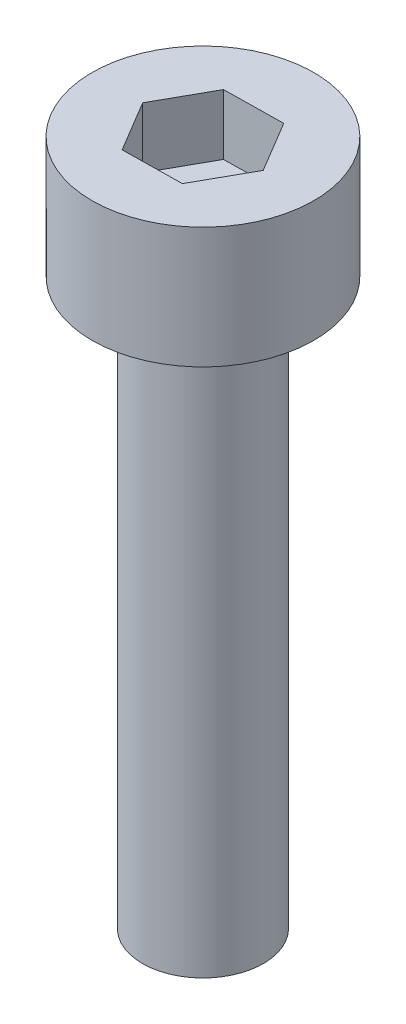
ISO-10303-21;
HEADER;
FILE_DESCRIPTION(('STEP AP214'),'2;1');
FILE_NAME('part.step','',(''),(''),'','','');
FILE_SCHEMA(('AUTOMOTIVE_DESIGN { 1 0 10303 214 1 1 1 1 }'));
ENDSEC;
DATA;
#1=APPLICATION_CONTEXT('core data for automotive mechanical design processes');
#2=APPLICATION_PROTOCOL_DEFINITION('international standard','automotive_design',2000,#1);
#3=PRODUCT_CONTEXT('',#1,'mechanical');
#4=PRODUCT('Part','Part','',(#3));
#5=PRODUCT_RELATED_PRODUCT_CATEGORY('part','',(#4));
#6=PRODUCT_DEFINITION_FORMATION('','',#4);
#7=PRODUCT_DEFINITION_CONTEXT('part definition',#1,'design');
#8=PRODUCT_DEFINITION('design','',#6,#7);
#9=PRODUCT_DEFINITION_SHAPE('','',#8);
#10=(LENGTH_UNIT() NAMED_UNIT(*) SI_UNIT(.MILLI.,.METRE.));
#11=(NAMED_UNIT(*) PLANE_ANGLE_UNIT() SI_UNIT($,.RADIAN.));
#12=(NAMED_UNIT(*) SI_UNIT($,.STERADIAN.) SOLID_ANGLE_UNIT());
#13=UNCERTAINTY_MEASURE_WITH_UNIT(LENGTH_MEASURE(1.E-05),#10,'distance_accuracy_value','');
#14=(GEOMETRIC_REPRESENTATION_CONTEXT(3) GLOBAL_UNCERTAINTY_ASSIGNED_CONTEXT((#13)) GLOBAL_UNIT_ASSIGNED_CONTEXT((#10,
#11,#12)) REPRESENTATION_CONTEXT('',''));
#15=CARTESIAN_POINT('',(0.,0.,0.));
#16=DIRECTION('',(0.,0.,1.));
#17=DIRECTION('',(1.,0.,0.));
#18=AXIS2_PLACEMENT_3D('',#15,#16,#17);
#19=CARTESIAN_POINT('',(0.,14.,0.));
#20=DIRECTION('',(0.,-1.,0.));
#21=DIRECTION('',(0.,0.,-1.));
#22=AXIS2_PLACEMENT_3D('',#19,#20,#21);
#23=CYLINDRICAL_SURFACE('',#22,1.5);
#24=CARTESIAN_POINT('',(0.,14.,0.));
#25=DIRECTION('',(0.,1.,0.));
#26=DIRECTION('',(0.,0.,1.));
#27=AXIS2_PLACEMENT_3D('',#24,#25,#26);
#28=CIRCLE('',#27,1.5);
#29=CARTESIAN_POINT('',(0.,14.,1.5));
#30=VERTEX_POINT('',#29);
#31=EDGE_CURVE('E11',#30,#30,#28,.T.);
#32=ORIENTED_EDGE('',*,*,#31,.F.);
#33=EDGE_LOOP('',(#32));
#34=FACE_BOUND('',#33,.T.);
#35=CARTESIAN_POINT('',(0.,0.,0.));
#36=DIRECTION('',(0.,1.,0.));
#37=DIRECTION('',(0.,0.,1.));
#38=AXIS2_PLACEMENT_3D('',#35,#36,#37);
#39=CIRCLE('',#38,1.5);
#40=CARTESIAN_POINT('',(0.,0.,1.5));
#41=VERTEX_POINT('',#40);
#42=EDGE_CURVE('E24',#41,#41,#39,.T.);
#43=ORIENTED_EDGE('',*,*,#42,.T.);
#44=EDGE_LOOP('',(#43));
#45=FACE_BOUND('',#44,.T.);
#46=ADVANCED_FACE('F17',(#34,#45),#23,.T.);
#47=CARTESIAN_POINT('',(0.,0.,0.));
#48=DIRECTION('',(0.,1.,0.));
#49=DIRECTION('',(0.,0.,1.));
#50=AXIS2_PLACEMENT_3D('',#47,#48,#49);
#51=PLANE('',#50);
#52=ORIENTED_EDGE('',*,*,#42,.F.);
#53=EDGE_LOOP('',(#52));
#54=FACE_BOUND('',#53,.T.);
#55=ADVANCED_FACE('F132',(#54),#51,.F.);
#56=CARTESIAN_POINT('',(0.,17.,0.));
#57=DIRECTION('',(0.,-1.,0.));
#58=DIRECTION('',(0.,0.,-1.));
#59=AXIS2_PLACEMENT_3D('',#56,#57,#58);
#60=CYLINDRICAL_SURFACE('',#59,2.75);
#61=CARTESIAN_POINT('',(0.,17.,0.));
#62=DIRECTION('',(0.,1.,0.));
#63=DIRECTION('',(0.,0.,1.));
#64=AXIS2_PLACEMENT_3D('',#61,#62,#63);
#65=CIRCLE('',#64,2.75);
#66=CARTESIAN_POINT('',(0.,17.,2.75));
#67=VERTEX_POINT('',#66);
#68=EDGE_CURVE('E126',#67,#67,#65,.T.);
#69=ORIENTED_EDGE('',*,*,#68,.F.);
#70=EDGE_LOOP('',(#69));
#71=FACE_BOUND('',#70,.T.);
#72=CARTESIAN_POINT('',(0.,14.,0.));
#73=DIRECTION('',(0.,1.,0.));
#74=DIRECTION('',(0.,0.,1.));
#75=AXIS2_PLACEMENT_3D('',#72,#73,#74);
#76=CIRCLE('',#75,2.75);
#77=CARTESIAN_POINT('',(0.,14.,2.75));
#78=VERTEX_POINT('',#77);
#79=EDGE_CURVE('E123',#78,#78,#76,.T.);
#80=ORIENTED_EDGE('',*,*,#79,.T.);
#81=EDGE_LOOP('',(#80));
#82=FACE_BOUND('',#81,.T.);
#83=ADVANCED_FACE('F134',(#71,#82),#60,.T.);
#84=CARTESIAN_POINT('',(0.,17.,0.));
#85=DIRECTION('',(0.,1.,0.));
#86=DIRECTION('',(0.,0.,1.));
#87=AXIS2_PLACEMENT_3D('',#84,#85,#86);
#88=PLANE('',#87);
#89=DIRECTION('',(0.999893086922528,0.,-0.0146224048821464));
#90=VECTOR('',#89,1.);
#91=CARTESIAN_POINT('',(-0.717399325967113,17.,1.28562755380473));
#92=LINE('',#91,#90);
#93=CARTESIAN_POINT('',(-0.717399325967113,17.,1.28562755380473));
#94=VERTEX_POINT('',#93);
#95=CARTESIAN_POINT('',(0.754686458416585,17.,1.26409981784772));
#96=VERTEX_POINT('',#95);
#97=EDGE_CURVE('E31',#94,#96,#92,.T.);
#98=ORIENTED_EDGE('',*,*,#97,.F.);
#99=DIRECTION('',(0.512609917553624,0.,0.858621611902278));
#100=VECTOR('',#99,1.);
#101=CARTESIAN_POINT('',(-1.4720857843837,17.,0.0215277359570126));
#102=LINE('',#101,#100);
#103=CARTESIAN_POINT('',(-1.4720857843837,17.,0.0215277359570126));
#104=VERTEX_POINT('',#103);
#105=EDGE_CURVE('E36',#104,#94,#102,.T.);
#106=ORIENTED_EDGE('',*,*,#105,.F.);
#107=DIRECTION('',(-0.487283169368904,0.,0.873244016784424));
#108=VECTOR('',#107,1.);
#109=CARTESIAN_POINT('',(-0.754686458416585,17.,-1.26409981784772));
#110=LINE('',#109,#108);
#111=CARTESIAN_POINT('',(-0.754686458416585,17.,-1.26409981784772));
#112=VERTEX_POINT('',#111);
#113=EDGE_CURVE('E118',#112,#104,#110,.T.);
#114=ORIENTED_EDGE('',*,*,#113,.F.);
#115=DIRECTION('',(-0.999893086922528,0.,0.0146224048821461));
#116=VECTOR('',#115,1.);
#117=CARTESIAN_POINT('',(0.717399325967112,17.,-1.28562755380473));
#118=LINE('',#117,#116);
#119=CARTESIAN_POINT('',(0.717399325967112,17.,-1.28562755380473));
#120=VERTEX_POINT('',#119);
#121=EDGE_CURVE('E115',#120,#112,#118,.T.);
#122=ORIENTED_EDGE('',*,*,#121,.F.);
#123=DIRECTION('',(-0.512609917553624,0.,-0.858621611902278));
#124=VECTOR('',#123,1.);
#125=CARTESIAN_POINT('',(1.4720857843837,17.,-0.0215277359570131));
#126=LINE('',#125,#124);
#127=CARTESIAN_POINT('',(1.4720857843837,17.,-0.0215277359570131));
#128=VERTEX_POINT('',#127);
#129=EDGE_CURVE('E113',#128,#120,#126,.T.);
#130=ORIENTED_EDGE('',*,*,#129,.F.);
#131=DIRECTION('',(0.487283169368904,0.,-0.873244016784425));
#132=VECTOR('',#131,1.);
#133=CARTESIAN_POINT('',(0.754686458416585,17.,1.26409981784772));
#134=LINE('',#133,#132);
#135=EDGE_CURVE('E87',#96,#128,#134,.T.);
#136=ORIENTED_EDGE('',*,*,#135,.F.);
#137=EDGE_LOOP('',(#98,#106,#114,#122,#130,#136));
#138=FACE_BOUND('',#137,.T.);
#139=ORIENTED_EDGE('',*,*,#68,.T.);
#140=EDGE_LOOP('',(#139));
#141=FACE_BOUND('',#140,.T.);
#142=ADVANCED_FACE('F140',(#138,#141),#88,.T.);
#143=CARTESIAN_POINT('',(0.,14.,0.));
#144=DIRECTION('',(0.,1.,0.));
#145=DIRECTION('',(0.,0.,1.));
#146=AXIS2_PLACEMENT_3D('',#143,#144,#145);
#147=PLANE('',#146);
#148=ORIENTED_EDGE('',*,*,#31,.T.);
#149=EDGE_LOOP('',(#148));
#150=FACE_BOUND('',#149,.T.);
#151=ORIENTED_EDGE('',*,*,#79,.F.);
#152=EDGE_LOOP('',(#151));
#153=FACE_BOUND('',#152,.T.);
#154=ADVANCED_FACE('F147',(#150,#153),#147,.F.);
#155=CARTESIAN_POINT('',(-0.717399325967113,15.5,1.28562755380473));
#156=DIRECTION('',(0.0146224048821464,0.,0.999893086922528));
#157=DIRECTION('',(0.999893086922528,0.,-0.0146224048821464));
#158=AXIS2_PLACEMENT_3D('',#155,#156,#157);
#159=PLANE('',#158);
#160=ORIENTED_EDGE('',*,*,#97,.T.);
#161=DIRECTION('',(0.,1.,0.));
#162=VECTOR('',#161,1.);
#163=CARTESIAN_POINT('',(0.754686458416585,15.5,1.26409981784772));
#164=LINE('',#163,#162);
#165=CARTESIAN_POINT('',(0.754686458416585,15.5,1.26409981784772));
#166=VERTEX_POINT('',#165);
#167=EDGE_CURVE('E110',#166,#96,#164,.T.);
#168=ORIENTED_EDGE('',*,*,#167,.F.);
#169=DIRECTION('',(0.999893086922528,0.,-0.0146224048821464));
#170=VECTOR('',#169,1.);
#171=CARTESIAN_POINT('',(-0.717399325967113,15.5,1.28562755380473));
#172=LINE('',#171,#170);
#173=CARTESIAN_POINT('',(-0.717399325967113,15.5,1.28562755380473));
#174=VERTEX_POINT('',#173);
#175=EDGE_CURVE('E91',#174,#166,#172,.T.);
#176=ORIENTED_EDGE('',*,*,#175,.F.);
#177=DIRECTION('',(0.,1.,0.));
#178=VECTOR('',#177,1.);
#179=CARTESIAN_POINT('',(-0.717399325967113,15.5,1.28562755380473));
#180=LINE('',#179,#178);
#181=EDGE_CURVE('E107',#174,#94,#180,.T.);
#182=ORIENTED_EDGE('',*,*,#181,.T.);
#183=EDGE_LOOP('',(#160,#168,#176,#182));
#184=FACE_BOUND('',#183,.T.);
#185=ADVANCED_FACE('F150',(#184),#159,.F.);
#186=CARTESIAN_POINT('',(-1.4720857843837,15.5,0.0215277359570126));
#187=DIRECTION('',(-0.858621611902278,0.,0.512609917553624));
#188=DIRECTION('',(0.512609917553624,0.,0.858621611902278));
#189=AXIS2_PLACEMENT_3D('',#186,#187,#188);
#190=PLANE('',#189);
#191=ORIENTED_EDGE('',*,*,#105,.T.);
#192=ORIENTED_EDGE('',*,*,#181,.F.);
#193=DIRECTION('',(0.512609917553624,0.,0.858621611902278));
#194=VECTOR('',#193,1.);
#195=CARTESIAN_POINT('',(-1.4720857843837,15.5,0.0215277359570126));
#196=LINE('',#195,#194);
#197=CARTESIAN_POINT('',(-1.4720857843837,15.5,0.0215277359570126));
#198=VERTEX_POINT('',#197);
#199=EDGE_CURVE('E105',#198,#174,#196,.T.);
#200=ORIENTED_EDGE('',*,*,#199,.F.);
#201=DIRECTION('',(0.,1.,0.));
#202=VECTOR('',#201,1.);
#203=CARTESIAN_POINT('',(-1.4720857843837,15.5,0.0215277359570126));
#204=LINE('',#203,#202);
#205=EDGE_CURVE('E103',#198,#104,#204,.T.);
#206=ORIENTED_EDGE('',*,*,#205,.T.);
#207=EDGE_LOOP('',(#191,#192,#200,#206));
#208=FACE_BOUND('',#207,.T.);
#209=ADVANCED_FACE('F154',(#208),#190,.F.);
#210=CARTESIAN_POINT('',(-0.754686458416585,15.5,-1.26409981784772));
#211=DIRECTION('',(-0.873244016784425,0.,-0.487283169368904));
#212=DIRECTION('',(-0.487283169368904,0.,0.873244016784425));
#213=AXIS2_PLACEMENT_3D('',#210,#211,#212);
#214=PLANE('',#213);
#215=ORIENTED_EDGE('',*,*,#113,.T.);
#216=ORIENTED_EDGE('',*,*,#205,.F.);
#217=DIRECTION('',(-0.487283169368904,0.,0.873244016784424));
#218=VECTOR('',#217,1.);
#219=CARTESIAN_POINT('',(-0.754686458416585,15.5,-1.26409981784772));
#220=LINE('',#219,#218);
#221=CARTESIAN_POINT('',(-0.754686458416585,15.5,-1.26409981784772));
#222=VERTEX_POINT('',#221);
#223=EDGE_CURVE('E100',#222,#198,#220,.T.);
#224=ORIENTED_EDGE('',*,*,#223,.F.);
#225=DIRECTION('',(0.,1.,0.));
#226=VECTOR('',#225,1.);
#227=CARTESIAN_POINT('',(-0.754686458416585,15.5,-1.26409981784772));
#228=LINE('',#227,#226);
#229=EDGE_CURVE('E97',#222,#112,#228,.T.);
#230=ORIENTED_EDGE('',*,*,#229,.T.);
#231=EDGE_LOOP('',(#215,#216,#224,#230));
#232=FACE_BOUND('',#231,.T.);
#233=ADVANCED_FACE('F158',(#232),#214,.F.);
#234=CARTESIAN_POINT('',(0.717399325967112,15.5,-1.28562755380473));
#235=DIRECTION('',(-0.0146224048821461,0.,-0.999893086922528));
#236=DIRECTION('',(-0.999893086922528,0.,0.0146224048821461));
#237=AXIS2_PLACEMENT_3D('',#234,#235,#236);
#238=PLANE('',#237);
#239=ORIENTED_EDGE('',*,*,#121,.T.);
#240=ORIENTED_EDGE('',*,*,#229,.F.);
#241=DIRECTION('',(-0.999893086922528,0.,0.0146224048821461));
#242=VECTOR('',#241,1.);
#243=CARTESIAN_POINT('',(0.717399325967112,15.5,-1.28562755380473));
#244=LINE('',#243,#242);
#245=CARTESIAN_POINT('',(0.717399325967112,15.5,-1.28562755380473));
#246=VERTEX_POINT('',#245);
#247=EDGE_CURVE('E95',#246,#222,#244,.T.);
#248=ORIENTED_EDGE('',*,*,#247,.F.);
#249=DIRECTION('',(0.,1.,0.));
#250=VECTOR('',#249,1.);
#251=CARTESIAN_POINT('',(0.717399325967112,15.5,-1.28562755380473));
#252=LINE('',#251,#250);
#253=EDGE_CURVE('E76',#246,#120,#252,.T.);
#254=ORIENTED_EDGE('',*,*,#253,.T.);
#255=EDGE_LOOP('',(#239,#240,#248,#254));
#256=FACE_BOUND('',#255,.T.);
#257=ADVANCED_FACE('F162',(#256),#238,.F.);
#258=CARTESIAN_POINT('',(1.4720857843837,15.5,-0.0215277359570131));
#259=DIRECTION('',(0.858621611902278,0.,-0.512609917553624));
#260=DIRECTION('',(-0.512609917553624,0.,-0.858621611902278));
#261=AXIS2_PLACEMENT_3D('',#258,#259,#260);
#262=PLANE('',#261);
#263=ORIENTED_EDGE('',*,*,#129,.T.);
#264=ORIENTED_EDGE('',*,*,#253,.F.);
#265=DIRECTION('',(-0.512609917553624,0.,-0.858621611902278));
#266=VECTOR('',#265,1.);
#267=CARTESIAN_POINT('',(1.4720857843837,15.5,-0.0215277359570131));
#268=LINE('',#267,#266);
#269=CARTESIAN_POINT('',(1.4720857843837,15.5,-0.0215277359570131));
#270=VERTEX_POINT('',#269);
#271=EDGE_CURVE('E69',#270,#246,#268,.T.);
#272=ORIENTED_EDGE('',*,*,#271,.F.);
#273=DIRECTION('',(0.,1.,0.));
#274=VECTOR('',#273,1.);
#275=CARTESIAN_POINT('',(1.4720857843837,15.5,-0.0215277359570131));
#276=LINE('',#275,#274);
#277=EDGE_CURVE('E73',#270,#128,#276,.T.);
#278=ORIENTED_EDGE('',*,*,#277,.T.);
#279=EDGE_LOOP('',(#263,#264,#272,#278));
#280=FACE_BOUND('',#279,.T.);
#281=ADVANCED_FACE('F72',(#280),#262,.F.);
#282=CARTESIAN_POINT('',(0.754686458416585,15.5,1.26409981784772));
#283=DIRECTION('',(0.873244016784425,0.,0.487283169368904));
#284=DIRECTION('',(0.487283169368904,0.,-0.873244016784425));
#285=AXIS2_PLACEMENT_3D('',#282,#283,#284);
#286=PLANE('',#285);
#287=ORIENTED_EDGE('',*,*,#135,.T.);
#288=ORIENTED_EDGE('',*,*,#277,.F.);
#289=DIRECTION('',(0.487283169368904,0.,-0.873244016784425));
#290=VECTOR('',#289,1.);
#291=CARTESIAN_POINT('',(0.754686458416585,15.5,1.26409981784772));
#292=LINE('',#291,#290);
#293=EDGE_CURVE('E85',#166,#270,#292,.T.);
#294=ORIENTED_EDGE('',*,*,#293,.F.);
#295=ORIENTED_EDGE('',*,*,#167,.T.);
#296=EDGE_LOOP('',(#287,#288,#294,#295));
#297=FACE_BOUND('',#296,.T.);
#298=ADVANCED_FACE('F83',(#297),#286,.F.);
#299=CARTESIAN_POINT('',(0.,15.5,0.));
#300=DIRECTION('',(0.,1.,0.));
#301=DIRECTION('',(0.,0.,1.));
#302=AXIS2_PLACEMENT_3D('',#299,#300,#301);
#303=PLANE('',#302);
#304=ORIENTED_EDGE('',*,*,#175,.T.);
#305=ORIENTED_EDGE('',*,*,#293,.T.);
#306=ORIENTED_EDGE('',*,*,#271,.T.);
#307=ORIENTED_EDGE('',*,*,#247,.T.);
#308=ORIENTED_EDGE('',*,*,#223,.T.);
#309=ORIENTED_EDGE('',*,*,#199,.T.);
#310=EDGE_LOOP('',(#304,#305,#306,#307,#308,#309));
#311=FACE_BOUND('',#310,.T.);
#312=ADVANCED_FACE('F89',(#311),#303,.T.);
#313=CLOSED_SHELL('',(#46,#55,#83,#142,#154,#185,#209,#233,#257,#281,#298,#312));
#314=MANIFOLD_SOLID_BREP('B1',#313);
#315=ADVANCED_BREP_SHAPE_REPRESENTATION('',(#18,#314),#14);
#316=SHAPE_DEFINITION_REPRESENTATION(#9,#315);
ENDSEC;
END-ISO-10303-21;
